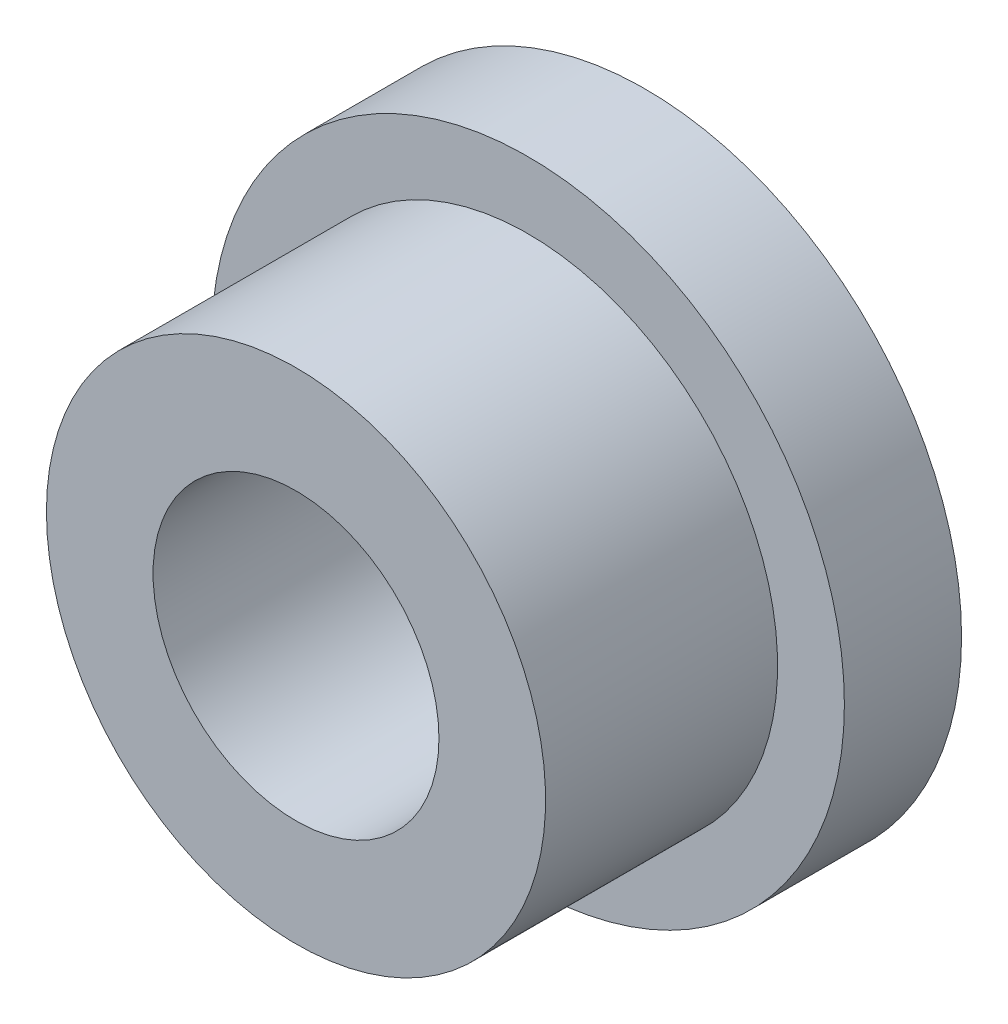
ISO-10303-21;
HEADER;
FILE_DESCRIPTION(('STEP AP214'),'2;1');
FILE_NAME('part.step','',(''),(''),'','','');
FILE_SCHEMA(('AUTOMOTIVE_DESIGN { 1 0 10303 214 1 1 1 1 }'));
ENDSEC;
DATA;
#1=APPLICATION_CONTEXT('core data for automotive mechanical design processes');
#2=APPLICATION_PROTOCOL_DEFINITION('international standard','automotive_design',2000,#1);
#3=PRODUCT_CONTEXT('',#1,'mechanical');
#4=PRODUCT('Part','Part','',(#3));
#5=PRODUCT_RELATED_PRODUCT_CATEGORY('part','',(#4));
#6=PRODUCT_DEFINITION_FORMATION('','',#4);
#7=PRODUCT_DEFINITION_CONTEXT('part definition',#1,'design');
#8=PRODUCT_DEFINITION('design','',#6,#7);
#9=PRODUCT_DEFINITION_SHAPE('','',#8);
#10=(LENGTH_UNIT() NAMED_UNIT(*) SI_UNIT(.MILLI.,.METRE.));
#11=(NAMED_UNIT(*) PLANE_ANGLE_UNIT() SI_UNIT($,.RADIAN.));
#12=(NAMED_UNIT(*) SI_UNIT($,.STERADIAN.) SOLID_ANGLE_UNIT());
#13=UNCERTAINTY_MEASURE_WITH_UNIT(LENGTH_MEASURE(1.E-05),#10,'distance_accuracy_value','');
#14=(GEOMETRIC_REPRESENTATION_CONTEXT(3) GLOBAL_UNCERTAINTY_ASSIGNED_CONTEXT((#13)) GLOBAL_UNIT_ASSIGNED_CONTEXT((#10,
#11,#12)) REPRESENTATION_CONTEXT('',''));
#15=CARTESIAN_POINT('',(0.,0.,0.));
#16=DIRECTION('',(0.,0.,1.));
#17=DIRECTION('',(1.,0.,0.));
#18=AXIS2_PLACEMENT_3D('',#15,#16,#17);
#19=CARTESIAN_POINT('',(0.,0.,14.9));
#20=DIRECTION('',(0.,0.,1.));
#21=DIRECTION('',(1.,0.,0.));
#22=AXIS2_PLACEMENT_3D('',#19,#20,#21);
#23=PLANE('',#22);
#24=CARTESIAN_POINT('',(0.,0.,14.9));
#25=DIRECTION('',(0.,0.,1.));
#26=DIRECTION('',(1.,0.,0.));
#27=AXIS2_PLACEMENT_3D('',#24,#25,#26);
#28=CIRCLE('',#27,10.65);
#29=CARTESIAN_POINT('',(-10.65,0.,14.9));
#30=VERTEX_POINT('',#29);
#31=EDGE_CURVE('E44',#30,#30,#28,.T.);
#32=ORIENTED_EDGE('',*,*,#31,.T.);
#33=EDGE_LOOP('',(#32));
#34=FACE_BOUND('',#33,.T.);
#35=CARTESIAN_POINT('',(0.,0.,14.9));
#36=DIRECTION('',(0.,0.,1.));
#37=DIRECTION('',(1.,0.,0.));
#38=AXIS2_PLACEMENT_3D('',#35,#36,#37);
#39=CIRCLE('',#38,6.1);
#40=CARTESIAN_POINT('',(6.1,0.,14.9));
#41=VERTEX_POINT('',#40);
#42=EDGE_CURVE('E35',#41,#41,#39,.F.);
#43=ORIENTED_EDGE('',*,*,#42,.T.);
#44=EDGE_LOOP('',(#43));
#45=FACE_BOUND('',#44,.T.);
#46=ADVANCED_FACE('F31',(#34,#45),#23,.T.);
#47=CARTESIAN_POINT('',(0.,0.,5.));
#48=DIRECTION('',(0.,0.,1.));
#49=DIRECTION('',(1.,0.,0.));
#50=AXIS2_PLACEMENT_3D('',#47,#48,#49);
#51=PLANE('',#50);
#52=CARTESIAN_POINT('',(0.,0.,5.));
#53=DIRECTION('',(0.,0.,1.));
#54=DIRECTION('',(1.,0.,0.));
#55=AXIS2_PLACEMENT_3D('',#52,#53,#54);
#56=CIRCLE('',#55,13.5);
#57=CARTESIAN_POINT('',(13.5,0.,5.));
#58=VERTEX_POINT('',#57);
#59=EDGE_CURVE('E10',#58,#58,#56,.T.);
#60=ORIENTED_EDGE('',*,*,#59,.T.);
#61=EDGE_LOOP('',(#60));
#62=FACE_BOUND('',#61,.T.);
#63=CARTESIAN_POINT('',(0.,0.,5.));
#64=DIRECTION('',(0.,0.,1.));
#65=DIRECTION('',(1.,0.,0.));
#66=AXIS2_PLACEMENT_3D('',#63,#64,#65);
#67=CIRCLE('',#66,10.65);
#68=CARTESIAN_POINT('',(-10.65,0.,5.));
#69=VERTEX_POINT('',#68);
#70=EDGE_CURVE('E46',#69,#69,#67,.T.);
#71=ORIENTED_EDGE('',*,*,#70,.F.);
#72=EDGE_LOOP('',(#71));
#73=FACE_BOUND('',#72,.T.);
#74=ADVANCED_FACE('F75',(#62,#73),#51,.T.);
#75=CARTESIAN_POINT('',(0.,0.,5.));
#76=DIRECTION('',(0.,0.,-1.));
#77=DIRECTION('',(-1.,0.,0.));
#78=AXIS2_PLACEMENT_3D('',#75,#76,#77);
#79=CYLINDRICAL_SURFACE('',#78,13.5);
#80=ORIENTED_EDGE('',*,*,#59,.F.);
#81=EDGE_LOOP('',(#80));
#82=FACE_BOUND('',#81,.T.);
#83=CARTESIAN_POINT('',(0.,0.,0.));
#84=DIRECTION('',(0.,0.,1.));
#85=DIRECTION('',(1.,0.,0.));
#86=AXIS2_PLACEMENT_3D('',#83,#84,#85);
#87=CIRCLE('',#86,13.5);
#88=CARTESIAN_POINT('',(13.5,0.,0.));
#89=VERTEX_POINT('',#88);
#90=EDGE_CURVE('E39',#89,#89,#87,.T.);
#91=ORIENTED_EDGE('',*,*,#90,.T.);
#92=EDGE_LOOP('',(#91));
#93=FACE_BOUND('',#92,.T.);
#94=ADVANCED_FACE('F33',(#82,#93),#79,.T.);
#95=CARTESIAN_POINT('',(0.,0.,0.));
#96=DIRECTION('',(0.,0.,1.));
#97=DIRECTION('',(1.,0.,0.));
#98=AXIS2_PLACEMENT_3D('',#95,#96,#97);
#99=PLANE('',#98);
#100=ORIENTED_EDGE('',*,*,#90,.F.);
#101=EDGE_LOOP('',(#100));
#102=FACE_BOUND('',#101,.T.);
#103=ADVANCED_FACE('F70',(#102),#99,.F.);
#104=CARTESIAN_POINT('',(0.,0.,14.9));
#105=DIRECTION('',(0.,0.,-1.));
#106=DIRECTION('',(-1.,0.,0.));
#107=AXIS2_PLACEMENT_3D('',#104,#105,#106);
#108=CYLINDRICAL_SURFACE('',#107,10.65);
#109=CARTESIAN_POINT('',(-10.65,0.,14.9));
#110=CARTESIAN_POINT('',(-10.65,0.,14.796875));
#111=CARTESIAN_POINT('',(-10.65,0.,14.69375));
#112=CARTESIAN_POINT('',(-10.65,0.,14.4875));
#113=CARTESIAN_POINT('',(-10.65,0.,14.384375));
#114=CARTESIAN_POINT('',(-10.65,0.,14.178125));
#115=CARTESIAN_POINT('',(-10.65,0.,14.075));
#116=CARTESIAN_POINT('',(-10.65,0.,13.86875));
#117=CARTESIAN_POINT('',(-10.65,0.,13.765625));
#118=CARTESIAN_POINT('',(-10.65,0.,13.559375));
#119=CARTESIAN_POINT('',(-10.65,0.,13.45625));
#120=CARTESIAN_POINT('',(-10.65,0.,13.25));
#121=CARTESIAN_POINT('',(-10.65,0.,13.146875));
#122=CARTESIAN_POINT('',(-10.65,0.,12.940625));
#123=CARTESIAN_POINT('',(-10.65,0.,12.8375));
#124=CARTESIAN_POINT('',(-10.65,0.,12.63125));
#125=CARTESIAN_POINT('',(-10.65,0.,12.528125));
#126=CARTESIAN_POINT('',(-10.65,0.,12.321875));
#127=CARTESIAN_POINT('',(-10.65,0.,12.21875));
#128=CARTESIAN_POINT('',(-10.65,0.,12.0125));
#129=CARTESIAN_POINT('',(-10.65,0.,11.909375));
#130=CARTESIAN_POINT('',(-10.65,0.,11.703125));
#131=CARTESIAN_POINT('',(-10.65,0.,11.6));
#132=CARTESIAN_POINT('',(-10.65,0.,11.39375));
#133=CARTESIAN_POINT('',(-10.65,0.,11.290625));
#134=CARTESIAN_POINT('',(-10.65,0.,11.084375));
#135=CARTESIAN_POINT('',(-10.65,0.,10.98125));
#136=CARTESIAN_POINT('',(-10.65,0.,10.775));
#137=CARTESIAN_POINT('',(-10.65,0.,10.671875));
#138=CARTESIAN_POINT('',(-10.65,0.,10.465625));
#139=CARTESIAN_POINT('',(-10.65,0.,10.3625));
#140=CARTESIAN_POINT('',(-10.65,0.,10.15625));
#141=CARTESIAN_POINT('',(-10.65,0.,10.053125));
#142=CARTESIAN_POINT('',(-10.65,0.,9.846875));
#143=CARTESIAN_POINT('',(-10.65,0.,9.74375));
#144=CARTESIAN_POINT('',(-10.65,0.,9.5375));
#145=CARTESIAN_POINT('',(-10.65,0.,9.434375));
#146=CARTESIAN_POINT('',(-10.65,0.,9.228125));
#147=CARTESIAN_POINT('',(-10.65,0.,9.125));
#148=CARTESIAN_POINT('',(-10.65,0.,8.91875));
#149=CARTESIAN_POINT('',(-10.65,0.,8.815625));
#150=CARTESIAN_POINT('',(-10.65,0.,8.609375));
#151=CARTESIAN_POINT('',(-10.65,0.,8.50625));
#152=CARTESIAN_POINT('',(-10.65,0.,8.3));
#153=CARTESIAN_POINT('',(-10.65,0.,8.196875));
#154=CARTESIAN_POINT('',(-10.65,0.,7.990625));
#155=CARTESIAN_POINT('',(-10.65,0.,7.8875));
#156=CARTESIAN_POINT('',(-10.65,0.,7.68125));
#157=CARTESIAN_POINT('',(-10.65,0.,7.578125));
#158=CARTESIAN_POINT('',(-10.65,0.,7.371875));
#159=CARTESIAN_POINT('',(-10.65,0.,7.26875));
#160=CARTESIAN_POINT('',(-10.65,0.,7.0625));
#161=CARTESIAN_POINT('',(-10.65,0.,6.959375));
#162=CARTESIAN_POINT('',(-10.65,0.,6.753125));
#163=CARTESIAN_POINT('',(-10.65,0.,6.65));
#164=CARTESIAN_POINT('',(-10.65,0.,6.44375));
#165=CARTESIAN_POINT('',(-10.65,0.,6.340625));
#166=CARTESIAN_POINT('',(-10.65,0.,6.134375));
#167=CARTESIAN_POINT('',(-10.65,0.,6.03125));
#168=CARTESIAN_POINT('',(-10.65,0.,5.825));
#169=CARTESIAN_POINT('',(-10.65,0.,5.721875));
#170=CARTESIAN_POINT('',(-10.65,0.,5.515625));
#171=CARTESIAN_POINT('',(-10.65,0.,5.4125));
#172=CARTESIAN_POINT('',(-10.65,0.,5.20625));
#173=CARTESIAN_POINT('',(-10.65,0.,5.103125));
#174=CARTESIAN_POINT('',(-10.65,0.,5.));
#175=B_SPLINE_CURVE_WITH_KNOTS('',3,(#109,#110,#111,#112,#113,#114,#115,#116,#117,#118,#119,
#120,#121,#122,#123,#124,#125,#126,#127,#128,#129,#130,#131,#132,#133,#134,#135,#136,#137,#138,
#139,#140,#141,#142,#143,#144,#145,#146,#147,#148,#149,#150,#151,#152,#153,#154,#155,#156,#157,
#158,#159,#160,#161,#162,#163,#164,#165,#166,#167,#168,#169,#170,#171,#172,#173,#174),
.UNSPECIFIED.,.F.,.F.,(4,2,2,2,2,2,2,2,2,2,2,2,2,2,2,2,2,2,2,2,2,2,2,2,2,2,2,2,2,2,2,2,4),(0.,
0.309374999999999,0.618749999999999,0.928124999999998,1.2375,1.546875,1.85625,2.165625,2.475,
2.784375,3.09375,3.403125,3.7125,4.021875,4.33125,4.640625,4.95,5.259375,5.56875,5.878125,
6.1875,6.496875,6.80625,7.115625,7.425,7.734375,8.04375,8.353125,8.6625,8.971875,9.28125,
9.590625,9.9),.UNSPECIFIED.);
#176=EDGE_CURVE('BSEAM63',#30,#69,#175,.T.);
#177=ORIENTED_EDGE('',*,*,#31,.F.);
#178=ORIENTED_EDGE('',*,*,#70,.T.);
#179=ORIENTED_EDGE('',*,*,#176,.T.);
#180=ORIENTED_EDGE('',*,*,#176,.F.);
#181=EDGE_LOOP('',(#177,#179,#178,#180));
#182=FACE_BOUND('',#181,.T.);
#183=ADVANCED_FACE('F63',(#182),#108,.T.);
#184=CARTESIAN_POINT('',(0.,0.,15.));
#185=DIRECTION('',(0.,0.,-1.));
#186=DIRECTION('',(-1.,0.,0.));
#187=AXIS2_PLACEMENT_3D('',#184,#185,#186);
#188=CYLINDRICAL_SURFACE('',#187,6.1);
#189=ORIENTED_EDGE('',*,*,#42,.F.);
#190=EDGE_LOOP('',(#189));
#191=FACE_BOUND('',#190,.T.);
#192=CARTESIAN_POINT('',(0.,0.,5.));
#193=DIRECTION('',(0.,0.,1.));
#194=DIRECTION('',(1.,0.,0.));
#195=AXIS2_PLACEMENT_3D('',#192,#193,#194);
#196=CIRCLE('',#195,6.1);
#197=CARTESIAN_POINT('',(6.1,0.,5.));
#198=VERTEX_POINT('',#197);
#199=EDGE_CURVE('E51',#198,#198,#196,.T.);
#200=ORIENTED_EDGE('',*,*,#199,.F.);
#201=EDGE_LOOP('',(#200));
#202=FACE_BOUND('',#201,.T.);
#203=ADVANCED_FACE('F59',(#191,#202),#188,.F.);
#204=CARTESIAN_POINT('',(0.,0.,5.));
#205=DIRECTION('',(0.,0.,1.));
#206=DIRECTION('',(1.,0.,0.));
#207=AXIS2_PLACEMENT_3D('',#204,#205,#206);
#208=PLANE('',#207);
#209=ORIENTED_EDGE('',*,*,#199,.T.);
#210=EDGE_LOOP('',(#209));
#211=FACE_BOUND('',#210,.T.);
#212=ADVANCED_FACE('F62',(#211),#208,.T.);
#213=CLOSED_SHELL('',(#46,#74,#94,#103,#183,#203,#212));
#214=MANIFOLD_SOLID_BREP('B2',#213);
#215=ADVANCED_BREP_SHAPE_REPRESENTATION('',(#18,#214),#14);
#216=SHAPE_DEFINITION_REPRESENTATION(#9,#215);
ENDSEC;
END-ISO-10303-21;
